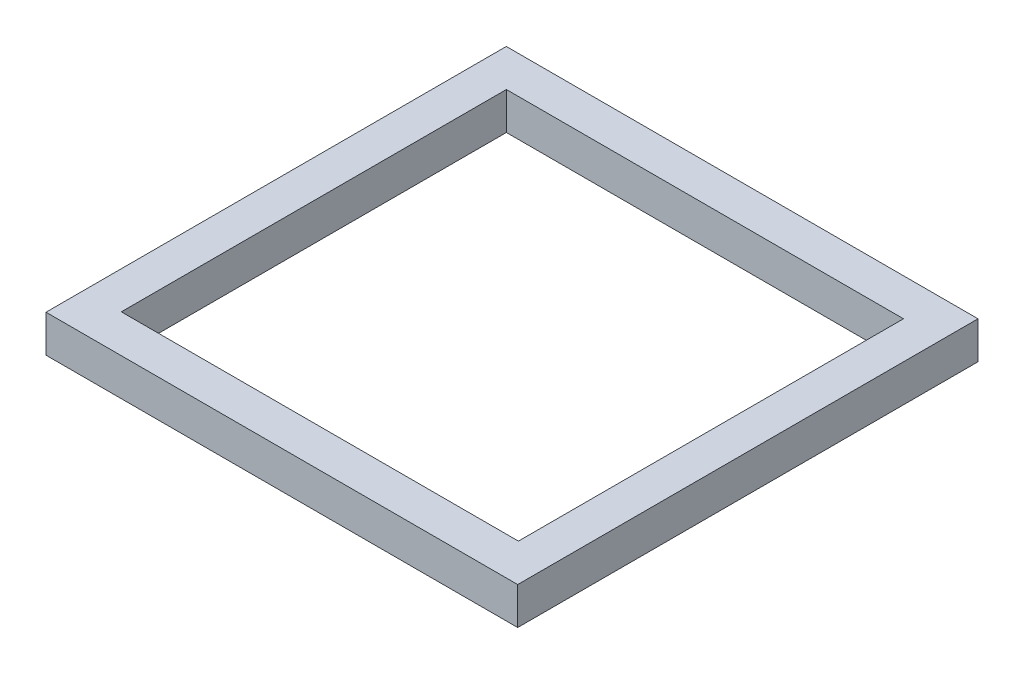
ISO-10303-21;
HEADER;
FILE_DESCRIPTION(('STEP AP214'),'2;1');
FILE_NAME('part.step','',(''),(''),'','','');
FILE_SCHEMA(('AUTOMOTIVE_DESIGN { 1 0 10303 214 1 1 1 1 }'));
ENDSEC;
DATA;
#1=APPLICATION_CONTEXT('core data for automotive mechanical design processes');
#2=APPLICATION_PROTOCOL_DEFINITION('international standard','automotive_design',2000,#1);
#3=PRODUCT_CONTEXT('',#1,'mechanical');
#4=PRODUCT('Part','Part','',(#3));
#5=PRODUCT_RELATED_PRODUCT_CATEGORY('part','',(#4));
#6=PRODUCT_DEFINITION_FORMATION('','',#4);
#7=PRODUCT_DEFINITION_CONTEXT('part definition',#1,'design');
#8=PRODUCT_DEFINITION('design','',#6,#7);
#9=PRODUCT_DEFINITION_SHAPE('','',#8);
#10=(LENGTH_UNIT() NAMED_UNIT(*) SI_UNIT(.MILLI.,.METRE.));
#11=(NAMED_UNIT(*) PLANE_ANGLE_UNIT() SI_UNIT($,.RADIAN.));
#12=(NAMED_UNIT(*) SI_UNIT($,.STERADIAN.) SOLID_ANGLE_UNIT());
#13=UNCERTAINTY_MEASURE_WITH_UNIT(LENGTH_MEASURE(1.E-05),#10,'distance_accuracy_value','');
#14=(GEOMETRIC_REPRESENTATION_CONTEXT(3) GLOBAL_UNCERTAINTY_ASSIGNED_CONTEXT((#13)) GLOBAL_UNIT_ASSIGNED_CONTEXT((#10,
#11,#12)) REPRESENTATION_CONTEXT('',''));
#15=CARTESIAN_POINT('',(0.,0.,0.));
#16=DIRECTION('',(0.,0.,1.));
#17=DIRECTION('',(1.,0.,0.));
#18=AXIS2_PLACEMENT_3D('',#15,#16,#17);
#19=CARTESIAN_POINT('',(0.,100.,0.));
#20=DIRECTION('',(0.,1.,0.));
#21=DIRECTION('',(0.,0.,1.));
#22=AXIS2_PLACEMENT_3D('',#19,#20,#21);
#23=PLANE('',#22);
#24=DIRECTION('',(0.,0.,1.));
#25=VECTOR('',#24,1.);
#26=CARTESIAN_POINT('',(-666.271829392586,100.,-600.));
#27=LINE('',#26,#25);
#28=CARTESIAN_POINT('',(-666.271829392586,100.,-600.));
#29=VERTEX_POINT('',#28);
#30=CARTESIAN_POINT('',(-666.271829392586,100.,635.70414175632));
#31=VERTEX_POINT('',#30);
#32=EDGE_CURVE('E138',#29,#31,#27,.T.);
#33=ORIENTED_EDGE('',*,*,#32,.T.);
#34=DIRECTION('',(1.,0.,0.));
#35=VECTOR('',#34,1.);
#36=CARTESIAN_POINT('',(-666.271829392586,100.,635.70414175632));
#37=LINE('',#36,#35);
#38=CARTESIAN_POINT('',(600.,100.,635.70414175632));
#39=VERTEX_POINT('',#38);
#40=EDGE_CURVE('E141',#31,#39,#37,.T.);
#41=ORIENTED_EDGE('',*,*,#40,.T.);
#42=DIRECTION('',(0.,0.,-1.));
#43=VECTOR('',#42,1.);
#44=CARTESIAN_POINT('',(600.,100.,-600.));
#45=LINE('',#44,#43);
#46=CARTESIAN_POINT('',(600.,100.,-600.));
#47=VERTEX_POINT('',#46);
#48=EDGE_CURVE('E144',#39,#47,#45,.T.);
#49=ORIENTED_EDGE('',*,*,#48,.T.);
#50=DIRECTION('',(-1.,0.,0.));
#51=VECTOR('',#50,1.);
#52=CARTESIAN_POINT('',(-666.271829392586,100.,-600.));
#53=LINE('',#52,#51);
#54=EDGE_CURVE('E146',#47,#29,#53,.T.);
#55=ORIENTED_EDGE('',*,*,#54,.T.);
#56=EDGE_LOOP('',(#33,#41,#49,#55));
#57=FACE_BOUND('',#56,.T.);
#58=DIRECTION('',(1.,0.,0.));
#59=VECTOR('',#58,1.);
#60=CARTESIAN_POINT('',(-566.072664352063,100.,533.747851993894));
#61=LINE('',#60,#59);
#62=CARTESIAN_POINT('',(-566.072664352063,100.,533.747851993894));
#63=VERTEX_POINT('',#62);
#64=CARTESIAN_POINT('',(500.,100.,533.747851993894));
#65=VERTEX_POINT('',#64);
#66=EDGE_CURVE('E110',#63,#65,#61,.T.);
#67=ORIENTED_EDGE('',*,*,#66,.F.);
#68=DIRECTION('',(0.,0.,1.));
#69=VECTOR('',#68,1.);
#70=CARTESIAN_POINT('',(-566.072664352063,100.,-500.));
#71=LINE('',#70,#69);
#72=CARTESIAN_POINT('',(-566.072664352063,100.,-500.));
#73=VERTEX_POINT('',#72);
#74=EDGE_CURVE('E102',#73,#63,#71,.T.);
#75=ORIENTED_EDGE('',*,*,#74,.F.);
#76=DIRECTION('',(-1.,0.,0.));
#77=VECTOR('',#76,1.);
#78=CARTESIAN_POINT('',(-566.072664352063,100.,-500.));
#79=LINE('',#78,#77);
#80=CARTESIAN_POINT('',(500.,100.,-500.));
#81=VERTEX_POINT('',#80);
#82=EDGE_CURVE('E124',#81,#73,#79,.T.);
#83=ORIENTED_EDGE('',*,*,#82,.F.);
#84=DIRECTION('',(0.,0.,-1.));
#85=VECTOR('',#84,1.);
#86=CARTESIAN_POINT('',(500.,100.,-500.));
#87=LINE('',#86,#85);
#88=EDGE_CURVE('E122',#65,#81,#87,.T.);
#89=ORIENTED_EDGE('',*,*,#88,.F.);
#90=EDGE_LOOP('',(#67,#75,#83,#89));
#91=FACE_BOUND('',#90,.T.);
#92=ADVANCED_FACE('F37',(#57,#91),#23,.T.);
#93=CARTESIAN_POINT('',(0.,0.,0.));
#94=DIRECTION('',(0.,1.,0.));
#95=DIRECTION('',(0.,0.,1.));
#96=AXIS2_PLACEMENT_3D('',#93,#94,#95);
#97=PLANE('',#96);
#98=DIRECTION('',(0.,0.,1.));
#99=VECTOR('',#98,1.);
#100=CARTESIAN_POINT('',(-666.271829392586,0.,-600.));
#101=LINE('',#100,#99);
#102=CARTESIAN_POINT('',(-666.271829392586,0.,-600.));
#103=VERTEX_POINT('',#102);
#104=CARTESIAN_POINT('',(-666.271829392586,0.,635.70414175632));
#105=VERTEX_POINT('',#104);
#106=EDGE_CURVE('E118',#103,#105,#101,.T.);
#107=ORIENTED_EDGE('',*,*,#106,.F.);
#108=DIRECTION('',(-1.,0.,0.));
#109=VECTOR('',#108,1.);
#110=CARTESIAN_POINT('',(-666.271829392586,0.,-600.));
#111=LINE('',#110,#109);
#112=CARTESIAN_POINT('',(600.,0.,-600.));
#113=VERTEX_POINT('',#112);
#114=EDGE_CURVE('E142',#113,#103,#111,.T.);
#115=ORIENTED_EDGE('',*,*,#114,.F.);
#116=DIRECTION('',(0.,0.,-1.));
#117=VECTOR('',#116,1.);
#118=CARTESIAN_POINT('',(600.,0.,-600.));
#119=LINE('',#118,#117);
#120=CARTESIAN_POINT('',(600.,0.,635.70414175632));
#121=VERTEX_POINT('',#120);
#122=EDGE_CURVE('E153',#121,#113,#119,.T.);
#123=ORIENTED_EDGE('',*,*,#122,.F.);
#124=DIRECTION('',(1.,0.,0.));
#125=VECTOR('',#124,1.);
#126=CARTESIAN_POINT('',(-666.271829392586,0.,635.70414175632));
#127=LINE('',#126,#125);
#128=EDGE_CURVE('E151',#105,#121,#127,.T.);
#129=ORIENTED_EDGE('',*,*,#128,.F.);
#130=EDGE_LOOP('',(#107,#115,#123,#129));
#131=FACE_BOUND('',#130,.T.);
#132=DIRECTION('',(0.,0.,1.));
#133=VECTOR('',#132,1.);
#134=CARTESIAN_POINT('',(-566.072664352063,0.,-500.));
#135=LINE('',#134,#133);
#136=CARTESIAN_POINT('',(-566.072664352063,0.,-500.));
#137=VERTEX_POINT('',#136);
#138=CARTESIAN_POINT('',(-566.072664352063,0.,533.747851993894));
#139=VERTEX_POINT('',#138);
#140=EDGE_CURVE('E60',#137,#139,#135,.T.);
#141=ORIENTED_EDGE('',*,*,#140,.T.);
#142=DIRECTION('',(1.,0.,0.));
#143=VECTOR('',#142,1.);
#144=CARTESIAN_POINT('',(-566.072664352063,0.,533.747851993894));
#145=LINE('',#144,#143);
#146=CARTESIAN_POINT('',(500.,0.,533.747851993894));
#147=VERTEX_POINT('',#146);
#148=EDGE_CURVE('E117',#139,#147,#145,.T.);
#149=ORIENTED_EDGE('',*,*,#148,.T.);
#150=DIRECTION('',(0.,0.,-1.));
#151=VECTOR('',#150,1.);
#152=CARTESIAN_POINT('',(500.,0.,-500.));
#153=LINE('',#152,#151);
#154=CARTESIAN_POINT('',(500.,0.,-500.));
#155=VERTEX_POINT('',#154);
#156=EDGE_CURVE('E130',#147,#155,#153,.T.);
#157=ORIENTED_EDGE('',*,*,#156,.T.);
#158=DIRECTION('',(-1.,0.,0.));
#159=VECTOR('',#158,1.);
#160=CARTESIAN_POINT('',(-566.072664352063,0.,-500.));
#161=LINE('',#160,#159);
#162=EDGE_CURVE('E111',#155,#137,#161,.T.);
#163=ORIENTED_EDGE('',*,*,#162,.T.);
#164=EDGE_LOOP('',(#141,#149,#157,#163));
#165=FACE_BOUND('',#164,.T.);
#166=ADVANCED_FACE('F171',(#131,#165),#97,.F.);
#167=CARTESIAN_POINT('',(-666.271829392586,100.,-600.));
#168=DIRECTION('',(1.,0.,0.));
#169=DIRECTION('',(0.,0.,-1.));
#170=AXIS2_PLACEMENT_3D('',#167,#168,#169);
#171=PLANE('',#170);
#172=ORIENTED_EDGE('',*,*,#106,.T.);
#173=DIRECTION('',(0.,-1.,0.));
#174=VECTOR('',#173,1.);
#175=CARTESIAN_POINT('',(-666.271829392586,100.,635.70414175632));
#176=LINE('',#175,#174);
#177=EDGE_CURVE('E11',#31,#105,#176,.T.);
#178=ORIENTED_EDGE('',*,*,#177,.F.);
#179=ORIENTED_EDGE('',*,*,#32,.F.);
#180=DIRECTION('',(0.,-1.,0.));
#181=VECTOR('',#180,1.);
#182=CARTESIAN_POINT('',(-666.271829392586,100.,-600.));
#183=LINE('',#182,#181);
#184=EDGE_CURVE('E148',#29,#103,#183,.T.);
#185=ORIENTED_EDGE('',*,*,#184,.T.);
#186=EDGE_LOOP('',(#172,#178,#179,#185));
#187=FACE_BOUND('',#186,.T.);
#188=ADVANCED_FACE('F39',(#187),#171,.F.);
#189=CARTESIAN_POINT('',(-666.271829392586,100.,635.70414175632));
#190=DIRECTION('',(0.,0.,-1.));
#191=DIRECTION('',(-1.,0.,0.));
#192=AXIS2_PLACEMENT_3D('',#189,#190,#191);
#193=PLANE('',#192);
#194=ORIENTED_EDGE('',*,*,#128,.T.);
#195=DIRECTION('',(0.,-1.,0.));
#196=VECTOR('',#195,1.);
#197=CARTESIAN_POINT('',(600.,100.,635.70414175632));
#198=LINE('',#197,#196);
#199=EDGE_CURVE('E45',#39,#121,#198,.T.);
#200=ORIENTED_EDGE('',*,*,#199,.F.);
#201=ORIENTED_EDGE('',*,*,#40,.F.);
#202=ORIENTED_EDGE('',*,*,#177,.T.);
#203=EDGE_LOOP('',(#194,#200,#201,#202));
#204=FACE_BOUND('',#203,.T.);
#205=ADVANCED_FACE('F181',(#204),#193,.F.);
#206=CARTESIAN_POINT('',(600.,100.,-600.));
#207=DIRECTION('',(-1.,0.,0.));
#208=DIRECTION('',(0.,0.,1.));
#209=AXIS2_PLACEMENT_3D('',#206,#207,#208);
#210=PLANE('',#209);
#211=ORIENTED_EDGE('',*,*,#122,.T.);
#212=DIRECTION('',(0.,-1.,0.));
#213=VECTOR('',#212,1.);
#214=CARTESIAN_POINT('',(600.,100.,-600.));
#215=LINE('',#214,#213);
#216=EDGE_CURVE('E158',#47,#113,#215,.T.);
#217=ORIENTED_EDGE('',*,*,#216,.F.);
#218=ORIENTED_EDGE('',*,*,#48,.F.);
#219=ORIENTED_EDGE('',*,*,#199,.T.);
#220=EDGE_LOOP('',(#211,#217,#218,#219));
#221=FACE_BOUND('',#220,.T.);
#222=ADVANCED_FACE('F165',(#221),#210,.F.);
#223=CARTESIAN_POINT('',(-666.271829392586,100.,-600.));
#224=DIRECTION('',(0.,0.,1.));
#225=DIRECTION('',(1.,0.,0.));
#226=AXIS2_PLACEMENT_3D('',#223,#224,#225);
#227=PLANE('',#226);
#228=ORIENTED_EDGE('',*,*,#114,.T.);
#229=ORIENTED_EDGE('',*,*,#184,.F.);
#230=ORIENTED_EDGE('',*,*,#54,.F.);
#231=ORIENTED_EDGE('',*,*,#216,.T.);
#232=EDGE_LOOP('',(#228,#229,#230,#231));
#233=FACE_BOUND('',#232,.T.);
#234=ADVANCED_FACE('F175',(#233),#227,.F.);
#235=CARTESIAN_POINT('',(-566.072664352063,100.,-500.));
#236=DIRECTION('',(1.,0.,0.));
#237=DIRECTION('',(0.,0.,-1.));
#238=AXIS2_PLACEMENT_3D('',#235,#236,#237);
#239=PLANE('',#238);
#240=ORIENTED_EDGE('',*,*,#140,.F.);
#241=DIRECTION('',(0.,-1.,0.));
#242=VECTOR('',#241,1.);
#243=CARTESIAN_POINT('',(-566.072664352063,100.,-500.));
#244=LINE('',#243,#242);
#245=EDGE_CURVE('E106',#73,#137,#244,.T.);
#246=ORIENTED_EDGE('',*,*,#245,.F.);
#247=ORIENTED_EDGE('',*,*,#74,.T.);
#248=DIRECTION('',(0.,-1.,0.));
#249=VECTOR('',#248,1.);
#250=CARTESIAN_POINT('',(-566.072664352063,100.,533.747851993894));
#251=LINE('',#250,#249);
#252=EDGE_CURVE('E105',#63,#139,#251,.T.);
#253=ORIENTED_EDGE('',*,*,#252,.T.);
#254=EDGE_LOOP('',(#240,#246,#247,#253));
#255=FACE_BOUND('',#254,.T.);
#256=ADVANCED_FACE('F104',(#255),#239,.T.);
#257=CARTESIAN_POINT('',(-566.072664352063,100.,533.747851993894));
#258=DIRECTION('',(0.,0.,-1.));
#259=DIRECTION('',(-1.,0.,0.));
#260=AXIS2_PLACEMENT_3D('',#257,#258,#259);
#261=PLANE('',#260);
#262=ORIENTED_EDGE('',*,*,#148,.F.);
#263=ORIENTED_EDGE('',*,*,#252,.F.);
#264=ORIENTED_EDGE('',*,*,#66,.T.);
#265=DIRECTION('',(0.,-1.,0.));
#266=VECTOR('',#265,1.);
#267=CARTESIAN_POINT('',(500.,100.,533.747851993894));
#268=LINE('',#267,#266);
#269=EDGE_CURVE('E119',#65,#147,#268,.T.);
#270=ORIENTED_EDGE('',*,*,#269,.T.);
#271=EDGE_LOOP('',(#262,#263,#264,#270));
#272=FACE_BOUND('',#271,.T.);
#273=ADVANCED_FACE('F114',(#272),#261,.T.);
#274=CARTESIAN_POINT('',(500.,100.,-500.));
#275=DIRECTION('',(-1.,0.,0.));
#276=DIRECTION('',(0.,0.,1.));
#277=AXIS2_PLACEMENT_3D('',#274,#275,#276);
#278=PLANE('',#277);
#279=ORIENTED_EDGE('',*,*,#156,.F.);
#280=ORIENTED_EDGE('',*,*,#269,.F.);
#281=ORIENTED_EDGE('',*,*,#88,.T.);
#282=DIRECTION('',(0.,-1.,0.));
#283=VECTOR('',#282,1.);
#284=CARTESIAN_POINT('',(500.,100.,-500.));
#285=LINE('',#284,#283);
#286=EDGE_CURVE('E52',#81,#155,#285,.T.);
#287=ORIENTED_EDGE('',*,*,#286,.T.);
#288=EDGE_LOOP('',(#279,#280,#281,#287));
#289=FACE_BOUND('',#288,.T.);
#290=ADVANCED_FACE('F204',(#289),#278,.T.);
#291=CARTESIAN_POINT('',(-566.072664352063,100.,-500.));
#292=DIRECTION('',(0.,0.,1.));
#293=DIRECTION('',(1.,0.,0.));
#294=AXIS2_PLACEMENT_3D('',#291,#292,#293);
#295=PLANE('',#294);
#296=ORIENTED_EDGE('',*,*,#162,.F.);
#297=ORIENTED_EDGE('',*,*,#286,.F.);
#298=ORIENTED_EDGE('',*,*,#82,.T.);
#299=ORIENTED_EDGE('',*,*,#245,.T.);
#300=EDGE_LOOP('',(#296,#297,#298,#299));
#301=FACE_BOUND('',#300,.T.);
#302=ADVANCED_FACE('F208',(#301),#295,.T.);
#303=CLOSED_SHELL('',(#92,#166,#188,#205,#222,#234,#256,#273,#290,#302));
#304=MANIFOLD_SOLID_BREP('B2',#303);
#305=ADVANCED_BREP_SHAPE_REPRESENTATION('',(#18,#304),#14);
#306=SHAPE_DEFINITION_REPRESENTATION(#9,#305);
ENDSEC;
END-ISO-10303-21;
